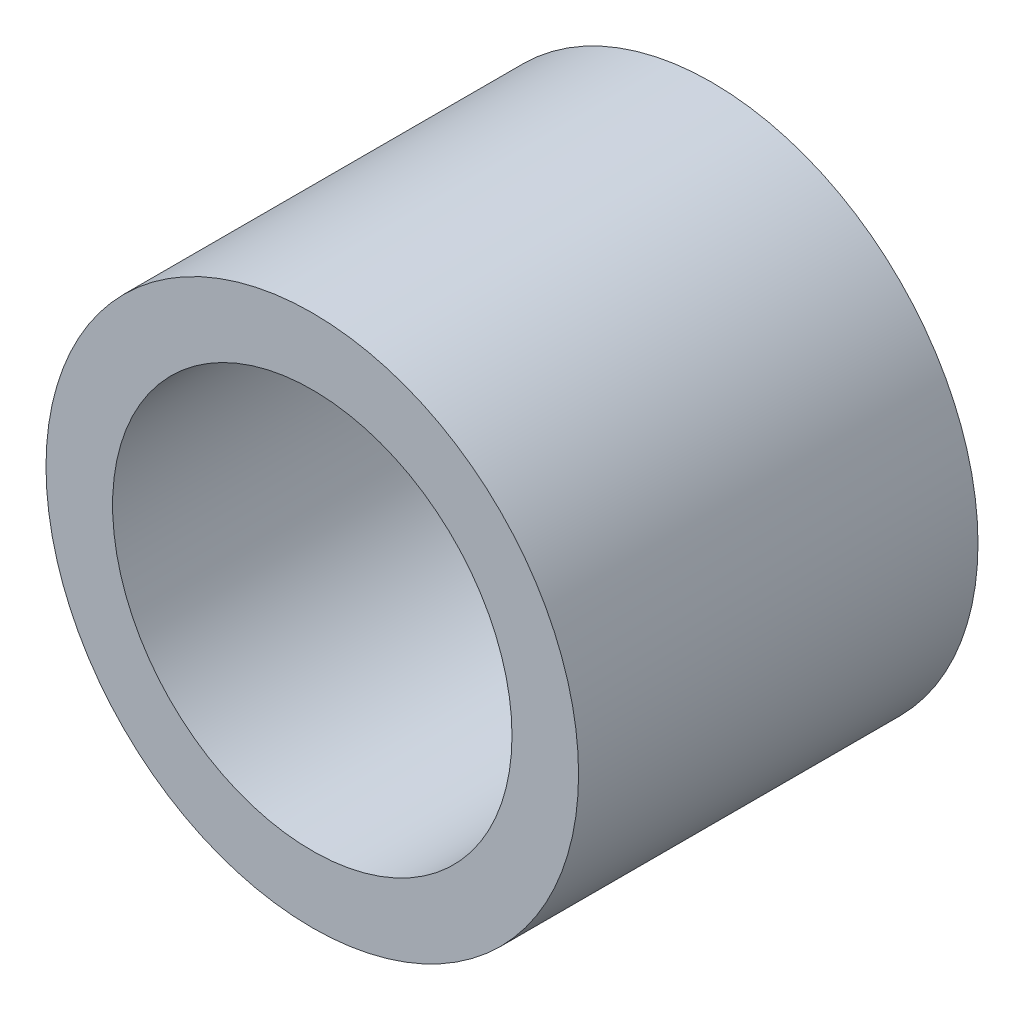
ISO-10303-21;
HEADER;
FILE_DESCRIPTION(('STEP AP214'),'2;1');
FILE_NAME('part.step','',(''),(''),'','','');
FILE_SCHEMA(('AUTOMOTIVE_DESIGN { 1 0 10303 214 1 1 1 1 }'));
ENDSEC;
DATA;
#1=APPLICATION_CONTEXT('core data for automotive mechanical design processes');
#2=APPLICATION_PROTOCOL_DEFINITION('international standard','automotive_design',2000,#1);
#3=PRODUCT_CONTEXT('',#1,'mechanical');
#4=PRODUCT('Part','Part','',(#3));
#5=PRODUCT_RELATED_PRODUCT_CATEGORY('part','',(#4));
#6=PRODUCT_DEFINITION_FORMATION('','',#4);
#7=PRODUCT_DEFINITION_CONTEXT('part definition',#1,'design');
#8=PRODUCT_DEFINITION('design','',#6,#7);
#9=PRODUCT_DEFINITION_SHAPE('','',#8);
#10=(LENGTH_UNIT() NAMED_UNIT(*) SI_UNIT(.MILLI.,.METRE.));
#11=(NAMED_UNIT(*) PLANE_ANGLE_UNIT() SI_UNIT($,.RADIAN.));
#12=(NAMED_UNIT(*) SI_UNIT($,.STERADIAN.) SOLID_ANGLE_UNIT());
#13=UNCERTAINTY_MEASURE_WITH_UNIT(LENGTH_MEASURE(1.E-05),#10,'distance_accuracy_value','');
#14=(GEOMETRIC_REPRESENTATION_CONTEXT(3) GLOBAL_UNCERTAINTY_ASSIGNED_CONTEXT((#13)) GLOBAL_UNIT_ASSIGNED_CONTEXT((#10,
#11,#12)) REPRESENTATION_CONTEXT('',''));
#15=CARTESIAN_POINT('',(0.,0.,0.));
#16=DIRECTION('',(0.,0.,1.));
#17=DIRECTION('',(1.,0.,0.));
#18=AXIS2_PLACEMENT_3D('',#15,#16,#17);
#19=CARTESIAN_POINT('',(0.,0.,3.));
#20=DIRECTION('',(0.,0.,1.));
#21=DIRECTION('',(1.,0.,0.));
#22=AXIS2_PLACEMENT_3D('',#19,#20,#21);
#23=PLANE('',#22);
#24=CARTESIAN_POINT('',(0.,0.,3.));
#25=DIRECTION('',(0.,0.,1.));
#26=DIRECTION('',(1.,0.,0.));
#27=AXIS2_PLACEMENT_3D('',#24,#25,#26);
#28=CIRCLE('',#27,2.);
#29=CARTESIAN_POINT('',(2.,0.,3.));
#30=VERTEX_POINT('',#29);
#31=EDGE_CURVE('E10',#30,#30,#28,.T.);
#32=ORIENTED_EDGE('',*,*,#31,.T.);
#33=EDGE_LOOP('',(#32));
#34=FACE_BOUND('',#33,.T.);
#35=CARTESIAN_POINT('',(0.,0.,3.));
#36=DIRECTION('',(0.,0.,1.));
#37=DIRECTION('',(1.,0.,0.));
#38=AXIS2_PLACEMENT_3D('',#35,#36,#37);
#39=CIRCLE('',#38,1.5);
#40=CARTESIAN_POINT('',(1.5,0.,3.));
#41=VERTEX_POINT('',#40);
#42=EDGE_CURVE('E26',#41,#41,#39,.T.);
#43=ORIENTED_EDGE('',*,*,#42,.F.);
#44=EDGE_LOOP('',(#43));
#45=FACE_BOUND('',#44,.T.);
#46=ADVANCED_FACE('F15',(#34,#45),#23,.T.);
#47=CARTESIAN_POINT('',(0.,0.,0.));
#48=DIRECTION('',(0.,0.,1.));
#49=DIRECTION('',(1.,0.,0.));
#50=AXIS2_PLACEMENT_3D('',#47,#48,#49);
#51=PLANE('',#50);
#52=CARTESIAN_POINT('',(0.,0.,0.));
#53=DIRECTION('',(0.,0.,1.));
#54=DIRECTION('',(1.,0.,0.));
#55=AXIS2_PLACEMENT_3D('',#52,#53,#54);
#56=CIRCLE('',#55,2.);
#57=CARTESIAN_POINT('',(2.,0.,0.));
#58=VERTEX_POINT('',#57);
#59=EDGE_CURVE('E19',#58,#58,#56,.T.);
#60=ORIENTED_EDGE('',*,*,#59,.F.);
#61=EDGE_LOOP('',(#60));
#62=FACE_BOUND('',#61,.T.);
#63=CARTESIAN_POINT('',(0.,0.,0.));
#64=DIRECTION('',(0.,0.,1.));
#65=DIRECTION('',(1.,0.,0.));
#66=AXIS2_PLACEMENT_3D('',#63,#64,#65);
#67=CIRCLE('',#66,1.5);
#68=CARTESIAN_POINT('',(1.5,0.,0.));
#69=VERTEX_POINT('',#68);
#70=EDGE_CURVE('E28',#69,#69,#67,.T.);
#71=ORIENTED_EDGE('',*,*,#70,.T.);
#72=EDGE_LOOP('',(#71));
#73=FACE_BOUND('',#72,.T.);
#74=ADVANCED_FACE('F38',(#62,#73),#51,.F.);
#75=CARTESIAN_POINT('',(0.,0.,3.));
#76=DIRECTION('',(0.,0.,-1.));
#77=DIRECTION('',(-1.,0.,0.));
#78=AXIS2_PLACEMENT_3D('',#75,#76,#77);
#79=CYLINDRICAL_SURFACE('',#78,2.);
#80=ORIENTED_EDGE('',*,*,#31,.F.);
#81=EDGE_LOOP('',(#80));
#82=FACE_BOUND('',#81,.T.);
#83=ORIENTED_EDGE('',*,*,#59,.T.);
#84=EDGE_LOOP('',(#83));
#85=FACE_BOUND('',#84,.T.);
#86=ADVANCED_FACE('F17',(#82,#85),#79,.T.);
#87=CARTESIAN_POINT('',(0.,0.,3.));
#88=DIRECTION('',(0.,0.,-1.));
#89=DIRECTION('',(-1.,0.,0.));
#90=AXIS2_PLACEMENT_3D('',#87,#88,#89);
#91=CYLINDRICAL_SURFACE('',#90,1.5);
#92=ORIENTED_EDGE('',*,*,#42,.T.);
#93=EDGE_LOOP('',(#92));
#94=FACE_BOUND('',#93,.T.);
#95=ORIENTED_EDGE('',*,*,#70,.F.);
#96=EDGE_LOOP('',(#95));
#97=FACE_BOUND('',#96,.T.);
#98=ADVANCED_FACE('F34',(#94,#97),#91,.F.);
#99=CLOSED_SHELL('',(#46,#74,#86,#98));
#100=MANIFOLD_SOLID_BREP('B1',#99);
#101=ADVANCED_BREP_SHAPE_REPRESENTATION('',(#18,#100),#14);
#102=SHAPE_DEFINITION_REPRESENTATION(#9,#101);
ENDSEC;
END-ISO-10303-21;
